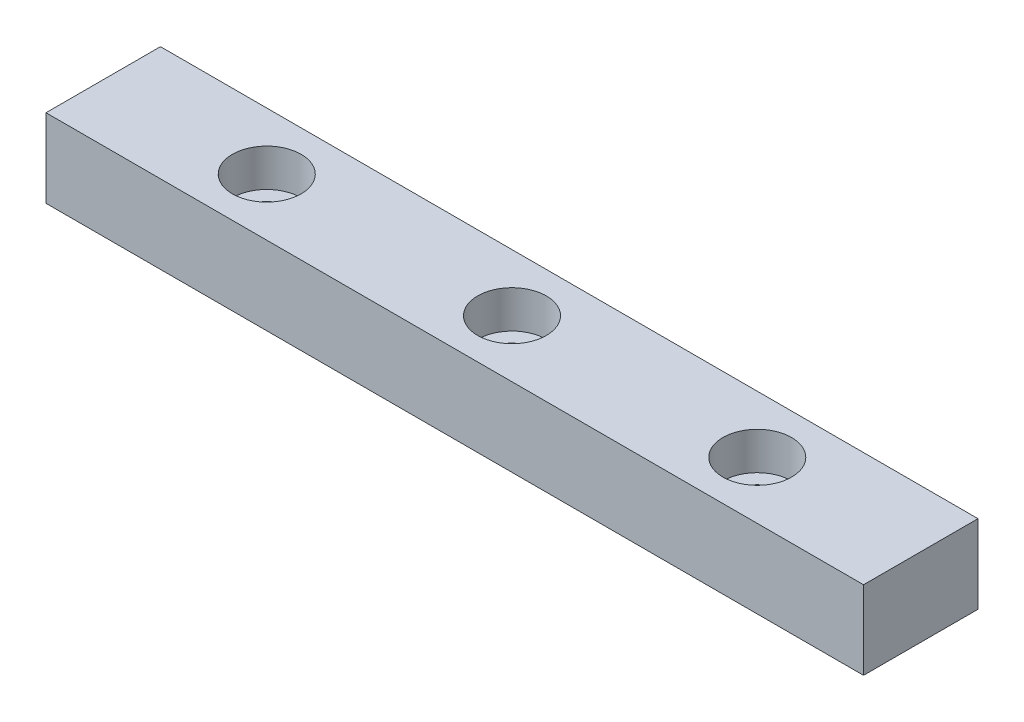
ISO-10303-21;
HEADER;
FILE_DESCRIPTION(('STEP AP214'),'2;1');
FILE_NAME('part.step','',(''),(''),'','','');
FILE_SCHEMA(('AUTOMOTIVE_DESIGN { 1 0 10303 214 1 1 1 1 }'));
ENDSEC;
DATA;
#1=APPLICATION_CONTEXT('core data for automotive mechanical design processes');
#2=APPLICATION_PROTOCOL_DEFINITION('international standard','automotive_design',2000,#1);
#3=PRODUCT_CONTEXT('',#1,'mechanical');
#4=PRODUCT('Part','Part','',(#3));
#5=PRODUCT_RELATED_PRODUCT_CATEGORY('part','',(#4));
#6=PRODUCT_DEFINITION_FORMATION('','',#4);
#7=PRODUCT_DEFINITION_CONTEXT('part definition',#1,'design');
#8=PRODUCT_DEFINITION('design','',#6,#7);
#9=PRODUCT_DEFINITION_SHAPE('','',#8);
#10=(LENGTH_UNIT() NAMED_UNIT(*) SI_UNIT(.MILLI.,.METRE.));
#11=(NAMED_UNIT(*) PLANE_ANGLE_UNIT() SI_UNIT($,.RADIAN.));
#12=(NAMED_UNIT(*) SI_UNIT($,.STERADIAN.) SOLID_ANGLE_UNIT());
#13=UNCERTAINTY_MEASURE_WITH_UNIT(LENGTH_MEASURE(1.E-05),#10,'distance_accuracy_value','');
#14=(GEOMETRIC_REPRESENTATION_CONTEXT(3) GLOBAL_UNCERTAINTY_ASSIGNED_CONTEXT((#13)) GLOBAL_UNIT_ASSIGNED_CONTEXT((#10,
#11,#12)) REPRESENTATION_CONTEXT('',''));
#15=CARTESIAN_POINT('',(0.,0.,0.));
#16=DIRECTION('',(0.,0.,1.));
#17=DIRECTION('',(1.,0.,0.));
#18=AXIS2_PLACEMENT_3D('',#15,#16,#17);
#19=CARTESIAN_POINT('',(-25.,4.8,-3.5));
#20=DIRECTION('',(1.,0.,0.));
#21=DIRECTION('',(0.,0.,-1.));
#22=AXIS2_PLACEMENT_3D('',#19,#20,#21);
#23=PLANE('',#22);
#24=DIRECTION('',(0.,0.,1.));
#25=VECTOR('',#24,1.);
#26=CARTESIAN_POINT('',(-25.,0.,-3.5));
#27=LINE('',#26,#25);
#28=CARTESIAN_POINT('',(-25.,0.,-3.5));
#29=VERTEX_POINT('',#28);
#30=CARTESIAN_POINT('',(-25.,0.,3.5));
#31=VERTEX_POINT('',#30);
#32=EDGE_CURVE('E101',#29,#31,#27,.T.);
#33=ORIENTED_EDGE('',*,*,#32,.T.);
#34=DIRECTION('',(0.,-1.,0.));
#35=VECTOR('',#34,1.);
#36=CARTESIAN_POINT('',(-25.,4.8,3.5));
#37=LINE('',#36,#35);
#38=CARTESIAN_POINT('',(-25.,4.8,3.5));
#39=VERTEX_POINT('',#38);
#40=EDGE_CURVE('E11',#39,#31,#37,.T.);
#41=ORIENTED_EDGE('',*,*,#40,.F.);
#42=DIRECTION('',(0.,0.,1.));
#43=VECTOR('',#42,1.);
#44=CARTESIAN_POINT('',(-25.,4.8,-3.5));
#45=LINE('',#44,#43);
#46=CARTESIAN_POINT('',(-25.,4.8,-3.5));
#47=VERTEX_POINT('',#46);
#48=EDGE_CURVE('E89',#47,#39,#45,.T.);
#49=ORIENTED_EDGE('',*,*,#48,.F.);
#50=DIRECTION('',(0.,-1.,0.));
#51=VECTOR('',#50,1.);
#52=CARTESIAN_POINT('',(-25.,4.8,-3.5));
#53=LINE('',#52,#51);
#54=EDGE_CURVE('E97',#47,#29,#53,.T.);
#55=ORIENTED_EDGE('',*,*,#54,.T.);
#56=EDGE_LOOP('',(#33,#41,#49,#55));
#57=FACE_BOUND('',#56,.T.);
#58=ADVANCED_FACE('F38',(#57),#23,.F.);
#59=CARTESIAN_POINT('',(-25.,4.8,3.5));
#60=DIRECTION('',(0.,0.,-1.));
#61=DIRECTION('',(-1.,0.,0.));
#62=AXIS2_PLACEMENT_3D('',#59,#60,#61);
#63=PLANE('',#62);
#64=DIRECTION('',(1.,0.,0.));
#65=VECTOR('',#64,1.);
#66=CARTESIAN_POINT('',(-25.,0.,3.5));
#67=LINE('',#66,#65);
#68=CARTESIAN_POINT('',(25.,0.,3.5));
#69=VERTEX_POINT('',#68);
#70=EDGE_CURVE('E93',#31,#69,#67,.T.);
#71=ORIENTED_EDGE('',*,*,#70,.T.);
#72=DIRECTION('',(0.,-1.,0.));
#73=VECTOR('',#72,1.);
#74=CARTESIAN_POINT('',(25.,4.8,3.5));
#75=LINE('',#74,#73);
#76=CARTESIAN_POINT('',(25.,4.8,3.5));
#77=VERTEX_POINT('',#76);
#78=EDGE_CURVE('E46',#77,#69,#75,.T.);
#79=ORIENTED_EDGE('',*,*,#78,.F.);
#80=DIRECTION('',(1.,0.,0.));
#81=VECTOR('',#80,1.);
#82=CARTESIAN_POINT('',(-25.,4.8,3.5));
#83=LINE('',#82,#81);
#84=EDGE_CURVE('E84',#39,#77,#83,.T.);
#85=ORIENTED_EDGE('',*,*,#84,.F.);
#86=ORIENTED_EDGE('',*,*,#40,.T.);
#87=EDGE_LOOP('',(#71,#79,#85,#86));
#88=FACE_BOUND('',#87,.T.);
#89=ADVANCED_FACE('F92',(#88),#63,.F.);
#90=CARTESIAN_POINT('',(25.,4.8,-3.5));
#91=DIRECTION('',(-1.,0.,0.));
#92=DIRECTION('',(0.,0.,1.));
#93=AXIS2_PLACEMENT_3D('',#90,#91,#92);
#94=PLANE('',#93);
#95=DIRECTION('',(0.,0.,-1.));
#96=VECTOR('',#95,1.);
#97=CARTESIAN_POINT('',(25.,0.,-3.5));
#98=LINE('',#97,#96);
#99=CARTESIAN_POINT('',(25.,0.,-3.5));
#100=VERTEX_POINT('',#99);
#101=EDGE_CURVE('E71',#69,#100,#98,.T.);
#102=ORIENTED_EDGE('',*,*,#101,.T.);
#103=DIRECTION('',(0.,-1.,0.));
#104=VECTOR('',#103,1.);
#105=CARTESIAN_POINT('',(25.,4.8,-3.5));
#106=LINE('',#105,#104);
#107=CARTESIAN_POINT('',(25.,4.8,-3.5));
#108=VERTEX_POINT('',#107);
#109=EDGE_CURVE('E94',#108,#100,#106,.T.);
#110=ORIENTED_EDGE('',*,*,#109,.F.);
#111=DIRECTION('',(0.,0.,-1.));
#112=VECTOR('',#111,1.);
#113=CARTESIAN_POINT('',(25.,4.8,-3.5));
#114=LINE('',#113,#112);
#115=EDGE_CURVE('E87',#77,#108,#114,.T.);
#116=ORIENTED_EDGE('',*,*,#115,.F.);
#117=ORIENTED_EDGE('',*,*,#78,.T.);
#118=EDGE_LOOP('',(#102,#110,#116,#117));
#119=FACE_BOUND('',#118,.T.);
#120=ADVANCED_FACE('F95',(#119),#94,.F.);
#121=CARTESIAN_POINT('',(-25.,4.8,-3.5));
#122=DIRECTION('',(0.,0.,1.));
#123=DIRECTION('',(1.,0.,0.));
#124=AXIS2_PLACEMENT_3D('',#121,#122,#123);
#125=PLANE('',#124);
#126=DIRECTION('',(-1.,0.,0.));
#127=VECTOR('',#126,1.);
#128=CARTESIAN_POINT('',(-25.,0.,-3.5));
#129=LINE('',#128,#127);
#130=EDGE_CURVE('E77',#100,#29,#129,.T.);
#131=ORIENTED_EDGE('',*,*,#130,.T.);
#132=ORIENTED_EDGE('',*,*,#54,.F.);
#133=DIRECTION('',(-1.,0.,0.));
#134=VECTOR('',#133,1.);
#135=CARTESIAN_POINT('',(-25.,4.8,-3.5));
#136=LINE('',#135,#134);
#137=EDGE_CURVE('E54',#108,#47,#136,.T.);
#138=ORIENTED_EDGE('',*,*,#137,.F.);
#139=ORIENTED_EDGE('',*,*,#109,.T.);
#140=EDGE_LOOP('',(#131,#132,#138,#139));
#141=FACE_BOUND('',#140,.T.);
#142=ADVANCED_FACE('F109',(#141),#125,.F.);
#143=CARTESIAN_POINT('',(0.,4.8,0.));
#144=DIRECTION('',(0.,1.,0.));
#145=DIRECTION('',(0.,0.,1.));
#146=AXIS2_PLACEMENT_3D('',#143,#144,#145);
#147=PLANE('',#146);
#148=CARTESIAN_POINT('',(15.,4.8,0.));
#149=DIRECTION('',(0.,1.,0.));
#150=DIRECTION('',(0.,0.,1.));
#151=AXIS2_PLACEMENT_3D('',#148,#149,#150);
#152=CIRCLE('',#151,2.1);
#153=CARTESIAN_POINT('',(15.,4.8,2.1));
#154=VERTEX_POINT('',#153);
#155=EDGE_CURVE('E124',#154,#154,#152,.T.);
#156=ORIENTED_EDGE('',*,*,#155,.F.);
#157=EDGE_LOOP('',(#156));
#158=FACE_BOUND('',#157,.T.);
#159=CARTESIAN_POINT('',(-15.,4.8,0.));
#160=DIRECTION('',(0.,1.,0.));
#161=DIRECTION('',(0.,0.,1.));
#162=AXIS2_PLACEMENT_3D('',#159,#160,#161);
#163=CIRCLE('',#162,2.1);
#164=CARTESIAN_POINT('',(-15.,4.8,2.1));
#165=VERTEX_POINT('',#164);
#166=EDGE_CURVE('E118',#165,#165,#163,.T.);
#167=ORIENTED_EDGE('',*,*,#166,.F.);
#168=EDGE_LOOP('',(#167));
#169=FACE_BOUND('',#168,.T.);
#170=CARTESIAN_POINT('',(0.,4.8,0.));
#171=DIRECTION('',(0.,1.,0.));
#172=DIRECTION('',(0.,0.,1.));
#173=AXIS2_PLACEMENT_3D('',#170,#171,#172);
#174=CIRCLE('',#173,2.1);
#175=CARTESIAN_POINT('',(0.,4.8,2.1));
#176=VERTEX_POINT('',#175);
#177=EDGE_CURVE('E115',#176,#176,#174,.T.);
#178=ORIENTED_EDGE('',*,*,#177,.F.);
#179=EDGE_LOOP('',(#178));
#180=FACE_BOUND('',#179,.T.);
#181=ORIENTED_EDGE('',*,*,#48,.T.);
#182=ORIENTED_EDGE('',*,*,#84,.T.);
#183=ORIENTED_EDGE('',*,*,#115,.T.);
#184=ORIENTED_EDGE('',*,*,#137,.T.);
#185=EDGE_LOOP('',(#181,#182,#183,#184));
#186=FACE_BOUND('',#185,.T.);
#187=ADVANCED_FACE('F85',(#158,#169,#180,#186),#147,.T.);
#188=CARTESIAN_POINT('',(0.,0.,0.));
#189=DIRECTION('',(0.,1.,0.));
#190=DIRECTION('',(0.,0.,1.));
#191=AXIS2_PLACEMENT_3D('',#188,#189,#190);
#192=PLANE('',#191);
#193=CARTESIAN_POINT('',(15.,0.,0.));
#194=DIRECTION('',(0.,1.,0.));
#195=DIRECTION('',(0.,0.,1.));
#196=AXIS2_PLACEMENT_3D('',#193,#194,#195);
#197=CIRCLE('',#196,1.2);
#198=CARTESIAN_POINT('',(15.,0.,1.2));
#199=VERTEX_POINT('',#198);
#200=EDGE_CURVE('E139',#199,#199,#197,.T.);
#201=ORIENTED_EDGE('',*,*,#200,.T.);
#202=EDGE_LOOP('',(#201));
#203=FACE_BOUND('',#202,.T.);
#204=CARTESIAN_POINT('',(-15.,0.,0.));
#205=DIRECTION('',(0.,1.,0.));
#206=DIRECTION('',(0.,0.,1.));
#207=AXIS2_PLACEMENT_3D('',#204,#205,#206);
#208=CIRCLE('',#207,1.2);
#209=CARTESIAN_POINT('',(-15.,0.,1.2));
#210=VERTEX_POINT('',#209);
#211=EDGE_CURVE('E145',#210,#210,#208,.T.);
#212=ORIENTED_EDGE('',*,*,#211,.T.);
#213=EDGE_LOOP('',(#212));
#214=FACE_BOUND('',#213,.T.);
#215=CARTESIAN_POINT('',(0.,0.,0.));
#216=DIRECTION('',(0.,1.,0.));
#217=DIRECTION('',(0.,0.,1.));
#218=AXIS2_PLACEMENT_3D('',#215,#216,#217);
#219=CIRCLE('',#218,1.2);
#220=CARTESIAN_POINT('',(0.,0.,1.2));
#221=VERTEX_POINT('',#220);
#222=EDGE_CURVE('E125',#221,#221,#219,.T.);
#223=ORIENTED_EDGE('',*,*,#222,.T.);
#224=EDGE_LOOP('',(#223));
#225=FACE_BOUND('',#224,.T.);
#226=ORIENTED_EDGE('',*,*,#32,.F.);
#227=ORIENTED_EDGE('',*,*,#130,.F.);
#228=ORIENTED_EDGE('',*,*,#101,.F.);
#229=ORIENTED_EDGE('',*,*,#70,.F.);
#230=EDGE_LOOP('',(#226,#227,#228,#229));
#231=FACE_BOUND('',#230,.T.);
#232=ADVANCED_FACE('F112',(#203,#214,#225,#231),#192,.F.);
#233=CARTESIAN_POINT('',(0.,2.5,0.));
#234=DIRECTION('',(0.,1.,0.));
#235=DIRECTION('',(0.,0.,1.));
#236=AXIS2_PLACEMENT_3D('',#233,#234,#235);
#237=CYLINDRICAL_SURFACE('',#236,2.1);
#238=CARTESIAN_POINT('',(0.,2.5,0.));
#239=DIRECTION('',(0.,1.,0.));
#240=DIRECTION('',(0.,0.,1.));
#241=AXIS2_PLACEMENT_3D('',#238,#239,#240);
#242=CIRCLE('',#241,2.1);
#243=CARTESIAN_POINT('',(0.,2.5,2.1));
#244=VERTEX_POINT('',#243);
#245=EDGE_CURVE('E104',#244,#244,#242,.T.);
#246=ORIENTED_EDGE('',*,*,#245,.F.);
#247=EDGE_LOOP('',(#246));
#248=FACE_BOUND('',#247,.T.);
#249=ORIENTED_EDGE('',*,*,#177,.T.);
#250=EDGE_LOOP('',(#249));
#251=FACE_BOUND('',#250,.T.);
#252=ADVANCED_FACE('F173',(#248,#251),#237,.F.);
#253=CARTESIAN_POINT('',(0.,2.5,0.));
#254=DIRECTION('',(0.,1.,0.));
#255=DIRECTION('',(0.,0.,1.));
#256=AXIS2_PLACEMENT_3D('',#253,#254,#255);
#257=PLANE('',#256);
#258=CARTESIAN_POINT('',(0.,2.5,0.));
#259=DIRECTION('',(0.,1.,0.));
#260=DIRECTION('',(0.,0.,1.));
#261=AXIS2_PLACEMENT_3D('',#258,#259,#260);
#262=CIRCLE('',#261,1.2);
#263=CARTESIAN_POINT('',(0.,2.5,1.2));
#264=VERTEX_POINT('',#263);
#265=EDGE_CURVE('E133',#264,#264,#262,.T.);
#266=ORIENTED_EDGE('',*,*,#265,.F.);
#267=EDGE_LOOP('',(#266));
#268=FACE_BOUND('',#267,.T.);
#269=ORIENTED_EDGE('',*,*,#245,.T.);
#270=EDGE_LOOP('',(#269));
#271=FACE_BOUND('',#270,.T.);
#272=ADVANCED_FACE('F163',(#268,#271),#257,.T.);
#273=CARTESIAN_POINT('',(-15.,2.5,0.));
#274=DIRECTION('',(0.,1.,0.));
#275=DIRECTION('',(0.,0.,1.));
#276=AXIS2_PLACEMENT_3D('',#273,#274,#275);
#277=CYLINDRICAL_SURFACE('',#276,2.1);
#278=CARTESIAN_POINT('',(-15.,2.5,0.));
#279=DIRECTION('',(0.,1.,0.));
#280=DIRECTION('',(0.,0.,1.));
#281=AXIS2_PLACEMENT_3D('',#278,#279,#280);
#282=CIRCLE('',#281,2.1);
#283=CARTESIAN_POINT('',(-15.,2.5,2.1));
#284=VERTEX_POINT('',#283);
#285=EDGE_CURVE('E128',#284,#284,#282,.T.);
#286=ORIENTED_EDGE('',*,*,#285,.F.);
#287=EDGE_LOOP('',(#286));
#288=FACE_BOUND('',#287,.T.);
#289=ORIENTED_EDGE('',*,*,#166,.T.);
#290=EDGE_LOOP('',(#289));
#291=FACE_BOUND('',#290,.T.);
#292=ADVANCED_FACE('F157',(#288,#291),#277,.F.);
#293=CARTESIAN_POINT('',(-15.,2.5,0.));
#294=DIRECTION('',(0.,1.,0.));
#295=DIRECTION('',(0.,0.,1.));
#296=AXIS2_PLACEMENT_3D('',#293,#294,#295);
#297=PLANE('',#296);
#298=CARTESIAN_POINT('',(-15.,2.5,0.));
#299=DIRECTION('',(0.,1.,0.));
#300=DIRECTION('',(0.,0.,1.));
#301=AXIS2_PLACEMENT_3D('',#298,#299,#300);
#302=CIRCLE('',#301,1.2);
#303=CARTESIAN_POINT('',(-15.,2.5,1.2));
#304=VERTEX_POINT('',#303);
#305=EDGE_CURVE('E136',#304,#304,#302,.T.);
#306=ORIENTED_EDGE('',*,*,#305,.F.);
#307=EDGE_LOOP('',(#306));
#308=FACE_BOUND('',#307,.T.);
#309=ORIENTED_EDGE('',*,*,#285,.T.);
#310=EDGE_LOOP('',(#309));
#311=FACE_BOUND('',#310,.T.);
#312=ADVANCED_FACE('F153',(#308,#311),#297,.T.);
#313=CARTESIAN_POINT('',(15.,2.5,0.));
#314=DIRECTION('',(0.,1.,0.));
#315=DIRECTION('',(0.,0.,1.));
#316=AXIS2_PLACEMENT_3D('',#313,#314,#315);
#317=CYLINDRICAL_SURFACE('',#316,2.1);
#318=CARTESIAN_POINT('',(15.,2.5,0.));
#319=DIRECTION('',(0.,1.,0.));
#320=DIRECTION('',(0.,0.,1.));
#321=AXIS2_PLACEMENT_3D('',#318,#319,#320);
#322=CIRCLE('',#321,2.1);
#323=CARTESIAN_POINT('',(15.,2.5,2.1));
#324=VERTEX_POINT('',#323);
#325=EDGE_CURVE('E121',#324,#324,#322,.T.);
#326=ORIENTED_EDGE('',*,*,#325,.F.);
#327=EDGE_LOOP('',(#326));
#328=FACE_BOUND('',#327,.T.);
#329=ORIENTED_EDGE('',*,*,#155,.T.);
#330=EDGE_LOOP('',(#329));
#331=FACE_BOUND('',#330,.T.);
#332=ADVANCED_FACE('F156',(#328,#331),#317,.F.);
#333=CARTESIAN_POINT('',(15.,2.5,0.));
#334=DIRECTION('',(0.,1.,0.));
#335=DIRECTION('',(0.,0.,1.));
#336=AXIS2_PLACEMENT_3D('',#333,#334,#335);
#337=PLANE('',#336);
#338=CARTESIAN_POINT('',(15.,2.5,0.));
#339=DIRECTION('',(0.,1.,0.));
#340=DIRECTION('',(0.,0.,1.));
#341=AXIS2_PLACEMENT_3D('',#338,#339,#340);
#342=CIRCLE('',#341,1.2);
#343=CARTESIAN_POINT('',(15.,2.5,1.2));
#344=VERTEX_POINT('',#343);
#345=EDGE_CURVE('E142',#344,#344,#342,.T.);
#346=ORIENTED_EDGE('',*,*,#345,.F.);
#347=EDGE_LOOP('',(#346));
#348=FACE_BOUND('',#347,.T.);
#349=ORIENTED_EDGE('',*,*,#325,.T.);
#350=EDGE_LOOP('',(#349));
#351=FACE_BOUND('',#350,.T.);
#352=ADVANCED_FACE('F235',(#348,#351),#337,.T.);
#353=CARTESIAN_POINT('',(0.,0.,0.));
#354=DIRECTION('',(0.,1.,0.));
#355=DIRECTION('',(0.,0.,1.));
#356=AXIS2_PLACEMENT_3D('',#353,#354,#355);
#357=CYLINDRICAL_SURFACE('',#356,1.2);
#358=ORIENTED_EDGE('',*,*,#222,.F.);
#359=EDGE_LOOP('',(#358));
#360=FACE_BOUND('',#359,.T.);
#361=ORIENTED_EDGE('',*,*,#265,.T.);
#362=EDGE_LOOP('',(#361));
#363=FACE_BOUND('',#362,.T.);
#364=ADVANCED_FACE('F240',(#360,#363),#357,.F.);
#365=CARTESIAN_POINT('',(-15.,0.,0.));
#366=DIRECTION('',(0.,1.,0.));
#367=DIRECTION('',(0.,0.,1.));
#368=AXIS2_PLACEMENT_3D('',#365,#366,#367);
#369=CYLINDRICAL_SURFACE('',#368,1.2);
#370=ORIENTED_EDGE('',*,*,#211,.F.);
#371=EDGE_LOOP('',(#370));
#372=FACE_BOUND('',#371,.T.);
#373=ORIENTED_EDGE('',*,*,#305,.T.);
#374=EDGE_LOOP('',(#373));
#375=FACE_BOUND('',#374,.T.);
#376=ADVANCED_FACE('F151',(#372,#375),#369,.F.);
#377=CARTESIAN_POINT('',(15.,0.,0.));
#378=DIRECTION('',(0.,1.,0.));
#379=DIRECTION('',(0.,0.,1.));
#380=AXIS2_PLACEMENT_3D('',#377,#378,#379);
#381=CYLINDRICAL_SURFACE('',#380,1.2);
#382=ORIENTED_EDGE('',*,*,#200,.F.);
#383=EDGE_LOOP('',(#382));
#384=FACE_BOUND('',#383,.T.);
#385=ORIENTED_EDGE('',*,*,#345,.T.);
#386=EDGE_LOOP('',(#385));
#387=FACE_BOUND('',#386,.T.);
#388=ADVANCED_FACE('F261',(#384,#387),#381,.F.);
#389=CLOSED_SHELL('',(#58,#89,#120,#142,#187,#232,#252,#272,#292,#312,#332,#352,#364,#376,#388));
#390=MANIFOLD_SOLID_BREP('B2',#389);
#391=ADVANCED_BREP_SHAPE_REPRESENTATION('',(#18,#390),#14);
#392=SHAPE_DEFINITION_REPRESENTATION(#9,#391);
ENDSEC;
END-ISO-10303-21;
